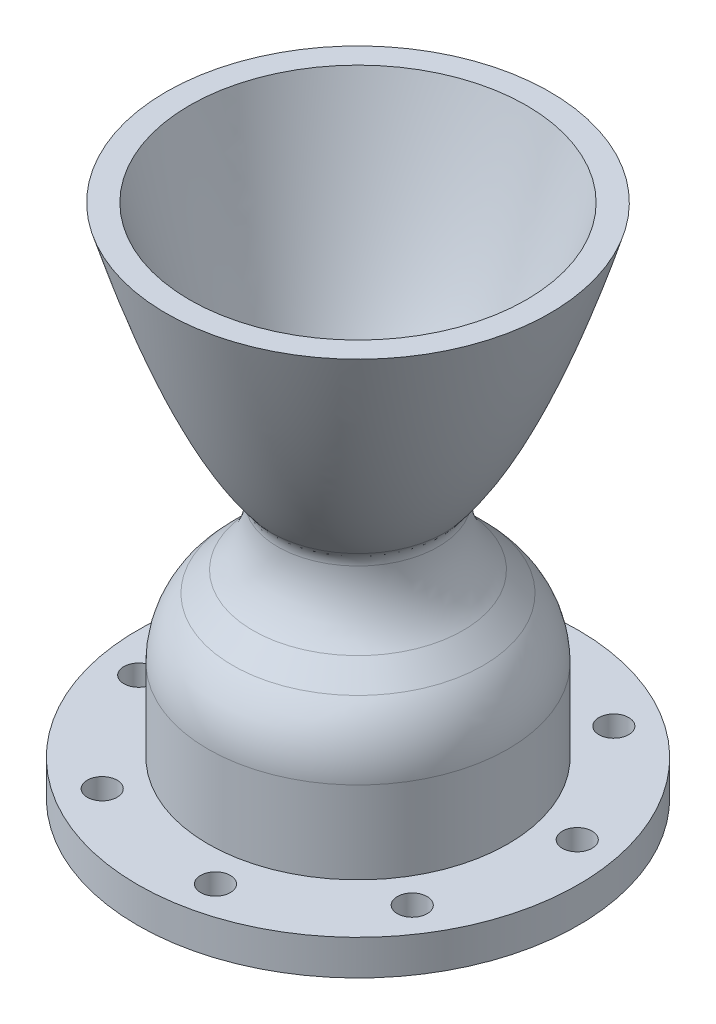
ISO-10303-21;
HEADER;
FILE_DESCRIPTION(('STEP AP214'),'2;1');
FILE_NAME('part.step','',(''),(''),'','','');
FILE_SCHEMA(('AUTOMOTIVE_DESIGN { 1 0 10303 214 1 1 1 1 }'));
ENDSEC;
DATA;
#1=APPLICATION_CONTEXT('core data for automotive mechanical design processes');
#2=APPLICATION_PROTOCOL_DEFINITION('international standard','automotive_design',2000,#1);
#3=PRODUCT_CONTEXT('',#1,'mechanical');
#4=PRODUCT('Part','Part','',(#3));
#5=PRODUCT_RELATED_PRODUCT_CATEGORY('part','',(#4));
#6=PRODUCT_DEFINITION_FORMATION('','',#4);
#7=PRODUCT_DEFINITION_CONTEXT('part definition',#1,'design');
#8=PRODUCT_DEFINITION('design','',#6,#7);
#9=PRODUCT_DEFINITION_SHAPE('','',#8);
#10=(LENGTH_UNIT() NAMED_UNIT(*) SI_UNIT(.MILLI.,.METRE.));
#11=(NAMED_UNIT(*) PLANE_ANGLE_UNIT() SI_UNIT($,.RADIAN.));
#12=(NAMED_UNIT(*) SI_UNIT($,.STERADIAN.) SOLID_ANGLE_UNIT());
#13=UNCERTAINTY_MEASURE_WITH_UNIT(LENGTH_MEASURE(1.E-05),#10,'distance_accuracy_value','');
#14=(GEOMETRIC_REPRESENTATION_CONTEXT(3) GLOBAL_UNCERTAINTY_ASSIGNED_CONTEXT((#13)) GLOBAL_UNIT_ASSIGNED_CONTEXT((#10,
#11,#12)) REPRESENTATION_CONTEXT('',''));
#15=CARTESIAN_POINT('',(0.,0.,0.));
#16=DIRECTION('',(0.,0.,1.));
#17=DIRECTION('',(1.,0.,0.));
#18=AXIS2_PLACEMENT_3D('',#15,#16,#17);
#19=CARTESIAN_POINT('',(-0.00553212594954357,165.815985113531,0.));
#20=DIRECTION('',(0.,1.,0.));
#21=DIRECTION('',(-1.,0.,0.));
#22=AXIS2_PLACEMENT_3D('',#19,#20,#21);
#23=CYLINDRICAL_SURFACE('',#22,53.8870597874087);
#24=CARTESIAN_POINT('',(-0.00553212594952976,-59.7275132223151,0.));
#25=DIRECTION('',(0.,1.,0.));
#26=DIRECTION('',(-1.,0.,0.));
#27=AXIS2_PLACEMENT_3D('',#24,#25,#26);
#28=CIRCLE('',#27,53.8870597874087);
#29=CARTESIAN_POINT('',(-53.8925919133582,-59.7275132223151,0.));
#30=VERTEX_POINT('',#29);
#31=EDGE_CURVE('E98',#30,#30,#28,.T.);
#32=ORIENTED_EDGE('',*,*,#31,.T.);
#33=EDGE_LOOP('',(#32));
#34=FACE_BOUND('',#33,.T.);
#35=CARTESIAN_POINT('',(-0.00553212594952706,-103.744683547694,0.));
#36=DIRECTION('',(0.,-1.,0.));
#37=DIRECTION('',(0.,0.,-1.));
#38=AXIS2_PLACEMENT_3D('',#35,#36,#37);
#39=CIRCLE('',#38,53.8870597874087);
#40=CARTESIAN_POINT('',(-0.00553212594952706,-103.744683547694,-53.8870597874087));
#41=VERTEX_POINT('',#40);
#42=EDGE_CURVE('E40',#41,#41,#39,.F.);
#43=ORIENTED_EDGE('',*,*,#42,.F.);
#44=EDGE_LOOP('',(#43));
#45=FACE_BOUND('',#44,.T.);
#46=ADVANCED_FACE('F36',(#34,#45),#23,.F.);
#47=CARTESIAN_POINT('',(0.,-109.744683547694,0.));
#48=DIRECTION('',(0.,1.,0.));
#49=DIRECTION('',(0.,0.,1.));
#50=AXIS2_PLACEMENT_3D('',#47,#48,#49);
#51=PLANE('',#50);
#52=CARTESIAN_POINT('',(0.,-109.744683547694,0.));
#53=DIRECTION('',(0.,-1.,0.));
#54=DIRECTION('',(0.,0.,-1.));
#55=AXIS2_PLACEMENT_3D('',#52,#53,#54);
#56=CIRCLE('',#55,56.8815276614592);
#57=CARTESIAN_POINT('',(0.,-109.744683547694,-56.8815276614592));
#58=VERTEX_POINT('',#57);
#59=EDGE_CURVE('E267',#58,#58,#56,.T.);
#60=ORIENTED_EDGE('',*,*,#59,.F.);
#61=EDGE_LOOP('',(#60));
#62=FACE_BOUND('',#61,.T.);
#63=CARTESIAN_POINT('',(0.,-109.744683547694,0.));
#64=DIRECTION('',(0.,1.,0.));
#65=DIRECTION('',(0.,0.,1.));
#66=AXIS2_PLACEMENT_3D('',#63,#64,#65);
#67=CIRCLE('',#66,93.8815276614418);
#68=CARTESIAN_POINT('',(0.,-109.744683547694,93.8815276614418));
#69=VERTEX_POINT('',#68);
#70=EDGE_CURVE('E10',#69,#69,#67,.T.);
#71=ORIENTED_EDGE('',*,*,#70,.F.);
#72=EDGE_LOOP('',(#71));
#73=FACE_BOUND('',#72,.T.);
#74=CARTESIAN_POINT('',(16.3377712930376,-109.744683547694,77.0486836093337));
#75=DIRECTION('',(0.,1.,0.));
#76=DIRECTION('',(0.,0.,1.));
#77=AXIS2_PLACEMENT_3D('',#74,#75,#76);
#78=CIRCLE('',#77,6.34999999999999);
#79=CARTESIAN_POINT('',(16.3377712930376,-109.744683547694,83.3986836093337));
#80=VERTEX_POINT('',#79);
#81=EDGE_CURVE('E50',#80,#80,#78,.F.);
#82=ORIENTED_EDGE('',*,*,#81,.F.);
#83=EDGE_LOOP('',(#82));
#84=FACE_BOUND('',#83,.T.);
#85=CARTESIAN_POINT('',(77.0486836093336,-109.744683547694,-16.3377712930379));
#86=DIRECTION('',(0.,1.,0.));
#87=DIRECTION('',(0.,0.,1.));
#88=AXIS2_PLACEMENT_3D('',#85,#86,#87);
#89=CIRCLE('',#88,6.34999999999998);
#90=CARTESIAN_POINT('',(77.0486836093336,-109.744683547694,-9.98777129303792));
#91=VERTEX_POINT('',#90);
#92=EDGE_CURVE('E60',#91,#91,#89,.F.);
#93=ORIENTED_EDGE('',*,*,#92,.F.);
#94=EDGE_LOOP('',(#93));
#95=FACE_BOUND('',#94,.T.);
#96=CARTESIAN_POINT('',(-16.3377712930382,-109.744683547694,-77.0486836093336));
#97=DIRECTION('',(0.,1.,0.));
#98=DIRECTION('',(0.,0.,1.));
#99=AXIS2_PLACEMENT_3D('',#96,#97,#98);
#100=CIRCLE('',#99,6.34999999999999);
#101=CARTESIAN_POINT('',(-16.3377712930382,-109.744683547694,-70.6986836093336));
#102=VERTEX_POINT('',#101);
#103=EDGE_CURVE('E68',#102,#102,#100,.F.);
#104=ORIENTED_EDGE('',*,*,#103,.F.);
#105=EDGE_LOOP('',(#104));
#106=FACE_BOUND('',#105,.T.);
#107=CARTESIAN_POINT('',(-77.0486836093335,-109.744683547694,16.3377712930384));
#108=DIRECTION('',(0.,1.,0.));
#109=DIRECTION('',(0.,0.,1.));
#110=AXIS2_PLACEMENT_3D('',#107,#108,#109);
#111=CIRCLE('',#110,6.34999999999998);
#112=CARTESIAN_POINT('',(-77.0486836093335,-109.744683547694,22.6877712930384));
#113=VERTEX_POINT('',#112);
#114=EDGE_CURVE('E76',#113,#113,#111,.F.);
#115=ORIENTED_EDGE('',*,*,#114,.F.);
#116=EDGE_LOOP('',(#115));
#117=FACE_BOUND('',#116,.T.);
#118=CARTESIAN_POINT('',(-66.0341955324388,-109.744683547694,-42.9290977908743));
#119=DIRECTION('',(0.,1.,0.));
#120=DIRECTION('',(0.,0.,1.));
#121=AXIS2_PLACEMENT_3D('',#118,#119,#120);
#122=CIRCLE('',#121,6.34999999999999);
#123=CARTESIAN_POINT('',(-66.0341955324388,-109.744683547694,-36.5790977908743));
#124=VERTEX_POINT('',#123);
#125=EDGE_CURVE('E72',#124,#124,#122,.F.);
#126=ORIENTED_EDGE('',*,*,#125,.F.);
#127=EDGE_LOOP('',(#126));
#128=FACE_BOUND('',#127,.T.);
#129=CARTESIAN_POINT('',(42.9290977908749,-109.744683547694,-66.0341955324384));
#130=DIRECTION('',(0.,1.,0.));
#131=DIRECTION('',(0.,0.,1.));
#132=AXIS2_PLACEMENT_3D('',#129,#130,#131);
#133=CIRCLE('',#132,6.34999999999999);
#134=CARTESIAN_POINT('',(42.9290977908749,-109.744683547694,-59.6841955324384));
#135=VERTEX_POINT('',#134);
#136=EDGE_CURVE('E64',#135,#135,#133,.F.);
#137=ORIENTED_EDGE('',*,*,#136,.F.);
#138=EDGE_LOOP('',(#137));
#139=FACE_BOUND('',#138,.T.);
#140=CARTESIAN_POINT('',(66.0341955324385,-109.744683547694,42.9290977908747));
#141=DIRECTION('',(0.,1.,0.));
#142=DIRECTION('',(0.,0.,1.));
#143=AXIS2_PLACEMENT_3D('',#140,#141,#142);
#144=CIRCLE('',#143,6.34999999999998);
#145=CARTESIAN_POINT('',(66.0341955324385,-109.744683547694,49.2790977908747));
#146=VERTEX_POINT('',#145);
#147=EDGE_CURVE('E56',#146,#146,#144,.F.);
#148=ORIENTED_EDGE('',*,*,#147,.F.);
#149=EDGE_LOOP('',(#148));
#150=FACE_BOUND('',#149,.T.);
#151=CARTESIAN_POINT('',(-42.9290977908749,-109.744683547694,66.0341955324384));
#152=DIRECTION('',(0.,1.,0.));
#153=DIRECTION('',(0.,0.,1.));
#154=AXIS2_PLACEMENT_3D('',#151,#152,#153);
#155=CIRCLE('',#154,6.34999999999999);
#156=CARTESIAN_POINT('',(-42.9290977908749,-109.744683547694,72.3841955324384));
#157=VERTEX_POINT('',#156);
#158=EDGE_CURVE('E45',#157,#157,#155,.F.);
#159=ORIENTED_EDGE('',*,*,#158,.F.);
#160=EDGE_LOOP('',(#159));
#161=FACE_BOUND('',#160,.T.);
#162=ADVANCED_FACE('F38',(#62,#73,#84,#95,#106,#117,#128,#139,#150,#161),#51,.F.);
#163=CARTESIAN_POINT('',(36.8348199161323,6.49222998464254,0.));
#164=CARTESIAN_POINT('',(59.2901874443699,34.627531396108,0.));
#165=CARTESIAN_POINT('',(81.7275236025348,109.927507640392,0.));
#166=B_SPLINE_CURVE_WITH_KNOTS('',2,(#163,#164,#165),.UNSPECIFIED.,.F.,.F.,(3,3),(0.,1.),.UNSPECIFIED.);
#167=CARTESIAN_POINT('',(-0.00553212594954357,165.815985113531,0.));
#168=DIRECTION('',(0.,1.,0.));
#169=AXIS1_PLACEMENT('',#167,#168);
#170=SURFACE_OF_REVOLUTION('',#166,#169);
#171=CARTESIAN_POINT('',(-0.00553212594954014,109.927507640393,0.));
#172=DIRECTION('',(0.,1.,0.));
#173=DIRECTION('',(-1.,0.,0.));
#174=AXIS2_PLACEMENT_3D('',#171,#172,#173);
#175=CIRCLE('',#174,81.7330557284828);
#176=CARTESIAN_POINT('',(-81.7385878544323,109.927507640393,0.));
#177=VERTEX_POINT('',#176);
#178=EDGE_CURVE('E122',#177,#177,#175,.T.);
#179=ORIENTED_EDGE('',*,*,#178,.F.);
#180=EDGE_LOOP('',(#179));
#181=FACE_BOUND('',#180,.T.);
#182=CARTESIAN_POINT('',(-0.00553212594953381,6.49222998464255,0.));
#183=DIRECTION('',(0.,1.,0.));
#184=DIRECTION('',(-1.,0.,0.));
#185=AXIS2_PLACEMENT_3D('',#182,#183,#184);
#186=CIRCLE('',#185,36.8403520420818);
#187=CARTESIAN_POINT('',(-36.8458841680313,6.49222998464255,0.));
#188=VERTEX_POINT('',#187);
#189=EDGE_CURVE('E118',#188,#188,#186,.T.);
#190=ORIENTED_EDGE('',*,*,#189,.T.);
#191=EDGE_LOOP('',(#190));
#192=FACE_BOUND('',#191,.T.);
#193=ADVANCED_FACE('F157',(#181,#192),#170,.T.);
#194=CARTESIAN_POINT('',(34.1386085874285,-0.0170096656933947,0.));
#195=CARTESIAN_POINT('',(34.1386092138728,0.0188829864821757,0.));
#196=CARTESIAN_POINT('',(34.1391470448244,0.0931040238253054,0.));
#197=CARTESIAN_POINT('',(34.1415644361508,0.25063140368994,0.));
#198=CARTESIAN_POINT('',(34.1480022812581,0.410054451399113,0.));
#199=CARTESIAN_POINT('',(34.1600743121532,0.629754600575022,0.));
#200=CARTESIAN_POINT('',(34.1809758004702,0.88442366214583,0.));
#201=CARTESIAN_POINT('',(34.214725432224,1.18552760717403,0.));
#202=CARTESIAN_POINT('',(34.2660400187457,1.52504083211395,0.));
#203=CARTESIAN_POINT('',(34.3300844148262,1.86398711124915,0.));
#204=CARTESIAN_POINT('',(34.406682314706,2.19934475428121,0.));
#205=CARTESIAN_POINT('',(34.4958642846635,2.53222975500066,0.));
#206=CARTESIAN_POINT('',(34.597282126498,2.86108297903266,0.));
#207=CARTESIAN_POINT('',(34.7111597839388,3.1863373753049,0.));
#208=CARTESIAN_POINT('',(34.836737484557,3.50661749150107,0.));
#209=CARTESIAN_POINT('',(34.974826690195,3.82265706702767,0.));
#210=CARTESIAN_POINT('',(35.1236110139373,4.13227251864,0.));
#211=CARTESIAN_POINT('',(35.285552935879,4.43777345706205,0.));
#212=CARTESIAN_POINT('',(35.4560292179553,4.73429190978832,0.));
#213=CARTESIAN_POINT('',(35.642055434384,5.02869419552913,0.));
#214=CARTESIAN_POINT('',(35.8313289833754,5.30850927023906,0.));
#215=CARTESIAN_POINT('',(36.0439461877771,5.59371787707124,0.));
#216=CARTESIAN_POINT('',(36.2184170875833,5.81590398160294,0.));
#217=CARTESIAN_POINT('',(36.4058864691957,6.03294197087187,0.));
#218=CARTESIAN_POINT('',(36.5440959612636,6.19163198042227,0.));
#219=CARTESIAN_POINT('',(36.7099827835806,6.36511211332681,0.));
#220=CARTESIAN_POINT('',(36.784060974214,6.44146917555451,0.));
#221=CARTESIAN_POINT('',(36.8348199161343,6.49222998464454,0.));
#222=B_SPLINE_CURVE_WITH_KNOTS('',4,(#194,#195,#196,#197,#198,#199,#200,#201,#202,#203,#204,
#205,#206,#207,#208,#209,#210,#211,#212,#213,#214,#215,#216,#217,#218,#219,#220,#221),
.UNSPECIFIED.,.F.,.F.,(5,1,1,1,1,1,1,1,1,1,1,1,1,1,1,1,1,1,1,1,1,1,1,1,5),(0.0825688161645696,
0.102426634352839,0.122284452541109,0.14214227072938,0.16200008891765,0.201715725294183,
0.241431361670735,0.281146998047275,0.320862634423797,0.360578270800353,0.400293907176888,
0.440009543553394,0.479725179929955,0.519440816306493,0.559156452683,0.598872089059578,
0.638587725436122,0.678303361812625,0.718018998189203,0.75773463456574,0.797450270942234,
0.837165907318803,0.857023725507066,0.876881543695329,0.916597180071815),.UNSPECIFIED.);
#223=CARTESIAN_POINT('',(-0.00553212594954357,165.815985113531,0.));
#224=DIRECTION('',(0.,1.,0.));
#225=AXIS1_PLACEMENT('',#223,#224);
#226=SURFACE_OF_REVOLUTION('',#222,#225);
#227=ORIENTED_EDGE('',*,*,#189,.F.);
#228=EDGE_LOOP('',(#227));
#229=FACE_BOUND('',#228,.T.);
#230=CARTESIAN_POINT('',(-0.00553212594953341,-0.0170096656934016,0.));
#231=DIRECTION('',(0.,1.,0.));
#232=DIRECTION('',(-1.,0.,0.));
#233=AXIS2_PLACEMENT_3D('',#230,#231,#232);
#234=CIRCLE('',#233,34.1441407133781);
#235=CARTESIAN_POINT('',(-34.1496728393276,-0.0170096656934037,0.));
#236=VERTEX_POINT('',#235);
#237=EDGE_CURVE('E114',#236,#236,#234,.T.);
#238=ORIENTED_EDGE('',*,*,#237,.T.);
#239=EDGE_LOOP('',(#238));
#240=FACE_BOUND('',#239,.T.);
#241=ADVANCED_FACE('F160',(#229,#240),#226,.T.);
#242=CARTESIAN_POINT('',(44.7258235411524,-25.5768317950047,0.));
#243=CARTESIAN_POINT('',(44.6759531633956,-25.5269596099439,0.));
#244=CARTESIAN_POINT('',(44.5764006953456,-25.4266587245276,0.));
#245=CARTESIAN_POINT('',(44.2850993772586,-25.1308779875125,0.));
#246=CARTESIAN_POINT('',(43.9753668585187,-24.8054940666709,0.));
#247=CARTESIAN_POINT('',(43.5479907628902,-24.346825922538,0.));
#248=CARTESIAN_POINT('',(43.1117965043717,-23.8570146922183,0.));
#249=CARTESIAN_POINT('',(42.6636691521947,-23.3374318133398,0.));
#250=CARTESIAN_POINT('',(42.1282768581647,-22.6904551548586,0.));
#251=CARTESIAN_POINT('',(41.4987079270069,-21.8914214338143,0.));
#252=CARTESIAN_POINT('',(40.7975627328722,-20.940869747371,0.));
#253=CARTESIAN_POINT('',(40.0349858342166,-19.8227530680833,0.));
#254=CARTESIAN_POINT('',(39.3160731270938,-18.6782974276713,0.));
#255=CARTESIAN_POINT('',(38.6396801277161,-17.5069484636707,0.));
#256=CARTESIAN_POINT('',(38.00802011548,-16.3116194627088,0.));
#257=CARTESIAN_POINT('',(37.421213849567,-15.0932067969428,0.));
#258=CARTESIAN_POINT('',(36.8805440492233,-13.8538971514291,0.));
#259=CARTESIAN_POINT('',(36.3864861170358,-12.5951090017168,0.));
#260=CARTESIAN_POINT('',(35.9399017074779,-11.3188292628671,0.));
#261=CARTESIAN_POINT('',(35.5413113461335,-10.0266468742744,0.));
#262=CARTESIAN_POINT('',(35.191336034827,-8.72058417969044,0.));
#263=CARTESIAN_POINT('',(34.8904259531819,-7.4021760795674,0.));
#264=CARTESIAN_POINT('',(34.639026762842,-6.07372042475105,0.));
#265=CARTESIAN_POINT('',(34.4626673958876,-4.90346005231736,0.));
#266=CARTESIAN_POINT('',(34.3428404240372,-3.89698833886601,0.));
#267=CARTESIAN_POINT('',(34.2718277633469,-3.13904361064676,0.));
#268=CARTESIAN_POINT('',(34.2323595563843,-2.63507906369353,0.));
#269=CARTESIAN_POINT('',(34.2047219420423,-2.21071653552501,0.));
#270=CARTESIAN_POINT('',(34.1857666833804,-1.87894926696856,0.));
#271=CARTESIAN_POINT('',(34.1699664593091,-1.53044472203816,0.));
#272=CARTESIAN_POINT('',(34.1573241663396,-1.21183173542845,0.));
#273=CARTESIAN_POINT('',(34.1478390450772,-0.841170060510904,0.));
#274=CARTESIAN_POINT('',(34.1415146507557,-0.560192579775888,0.));
#275=CARTESIAN_POINT('',(34.1391389654072,-0.230593853579133,0.));
#276=CARTESIAN_POINT('',(34.1386098181722,-0.0875383109502816,0.));
#277=CARTESIAN_POINT('',(34.1386085874286,-0.0170096684081623,0.));
#278=B_SPLINE_CURVE_WITH_KNOTS('',4,(#242,#243,#244,#245,#246,#247,#248,#249,#250,#251,#252,
#253,#254,#255,#256,#257,#258,#259,#260,#261,#262,#263,#264,#265,#266,#267,#268,#269,#270,#271,
#272,#273,#274,#275,#276,#277),.UNSPECIFIED.,.F.,.F.,(5,1,1,1,1,1,1,1,1,1,1,1,1,1,1,1,1,1,1,1,1,
1,1,1,1,1,1,1,1,1,1,1,5),(0.0826377294216884,0.0925749262389921,0.102512123155224,
0.122386516987688,0.14226091082015,0.162135304652612,0.182009698485073,0.201884092317534,
0.241632879982458,0.281381667647382,0.321130455312305,0.360879242977226,0.400628030642147,
0.440376818307068,0.480125605971989,0.51987439363691,0.559623181301831,0.599371968966752,
0.639120756631673,0.678869544296593,0.718618331961514,0.758367119626435,0.798115907291356,
0.817990301123817,0.837864694956278,0.847801891872509,0.857739088788739,0.86767628570497,
0.8776134826212,0.88755067953743,0.897487876453661,0.907425073369891,0.917362270382752),.UNSPECIFIED.);
#279=CARTESIAN_POINT('',(-0.00553212594954357,165.815985113531,0.));
#280=DIRECTION('',(0.,1.,0.));
#281=AXIS1_PLACEMENT('',#279,#280);
#282=SURFACE_OF_REVOLUTION('',#278,#281);
#283=ORIENTED_EDGE('',*,*,#237,.F.);
#284=EDGE_LOOP('',(#283));
#285=FACE_BOUND('',#284,.T.);
#286=CARTESIAN_POINT('',(-0.00553212594953185,-25.5768317950047,0.));
#287=DIRECTION('',(0.,1.,0.));
#288=DIRECTION('',(-1.,0.,0.));
#289=AXIS2_PLACEMENT_3D('',#286,#287,#288);
#290=CIRCLE('',#289,44.731355667102);
#291=CARTESIAN_POINT('',(-44.7368877930515,-25.5768317950047,0.));
#292=VERTEX_POINT('',#291);
#293=EDGE_CURVE('E110',#292,#292,#290,.T.);
#294=ORIENTED_EDGE('',*,*,#293,.T.);
#295=EDGE_LOOP('',(#294));
#296=FACE_BOUND('',#295,.T.);
#297=ADVANCED_FACE('F165',(#285,#296),#282,.T.);
#298=CARTESIAN_POINT('',(-0.00553212594953132,-34.184459992969,0.));
#299=DIRECTION('',(0.,-1.,0.));
#300=DIRECTION('',(1.,0.,0.));
#301=AXIS2_PLACEMENT_3D('',#298,#299,#300);
#302=CONICAL_SURFACE('',#301,53.338983865285,0.785398163410157);
#303=ORIENTED_EDGE('',*,*,#293,.F.);
#304=EDGE_LOOP('',(#303));
#305=FACE_BOUND('',#304,.T.);
#306=CARTESIAN_POINT('',(-0.00553212594953132,-34.184459992969,0.));
#307=DIRECTION('',(0.,1.,0.));
#308=DIRECTION('',(-1.,0.,0.));
#309=AXIS2_PLACEMENT_3D('',#306,#307,#308);
#310=CIRCLE('',#309,53.338983865285);
#311=CARTESIAN_POINT('',(-53.3445159912345,-34.184459992969,0.));
#312=VERTEX_POINT('',#311);
#313=EDGE_CURVE('E106',#312,#312,#310,.T.);
#314=ORIENTED_EDGE('',*,*,#313,.T.);
#315=EDGE_LOOP('',(#314));
#316=FACE_BOUND('',#315,.T.);
#317=ADVANCED_FACE('F198',(#305,#316),#302,.T.);
#318=CARTESIAN_POINT('',(63.8815276614741,-59.7610263901982,0.));
#319=CARTESIAN_POINT('',(63.8816355026311,-59.690496419455,0.));
#320=CARTESIAN_POINT('',(63.8813253047457,-59.548918716792,0.));
#321=CARTESIAN_POINT('',(63.8794657326396,-59.2150739553457,0.));
#322=CARTESIAN_POINT('',(63.8735691560645,-58.938295381732,0.));
#323=CARTESIAN_POINT('',(63.8646593192035,-58.5660531528386,0.));
#324=CARTESIAN_POINT('',(63.8525108889179,-58.2463041173915,0.));
#325=CARTESIAN_POINT('',(63.8334269887286,-57.8150309099507,0.));
#326=CARTESIAN_POINT('',(63.8041888991913,-57.3143505519465,0.));
#327=CARTESIAN_POINT('',(63.7608937854615,-56.7213211543192,0.));
#328=CARTESIAN_POINT('',(63.6832874979112,-55.8816823352566,0.));
#329=CARTESIAN_POINT('',(63.5847255468552,-55.0412144018694,0.));
#330=CARTESIAN_POINT('',(63.4652670469412,-54.2052982333501,0.));
#331=CARTESIAN_POINT('',(63.2969487701593,-53.2050265478941,0.));
#332=CARTESIAN_POINT('',(63.1037410766707,-52.2097441496842,0.));
#333=CARTESIAN_POINT('',(62.8795815883548,-51.2204925732428,0.));
#334=CARTESIAN_POINT('',(62.624738161908,-50.2390472471317,0.));
#335=CARTESIAN_POINT('',(62.3455205099134,-49.2642029821403,0.));
#336=CARTESIAN_POINT('',(62.0420758763036,-48.2966240410013,0.));
#337=CARTESIAN_POINT('',(61.6529925841726,-47.1791868431962,0.));
#338=CARTESIAN_POINT('',(61.1609222859813,-45.9196977042101,0.));
#339=CARTESIAN_POINT('',(60.6220530785514,-44.6794232750575,0.));
#340=CARTESIAN_POINT('',(60.0372649671842,-43.4602501831239,0.));
#341=CARTESIAN_POINT('',(59.4071739961785,-42.2636660495198,0.));
#342=CARTESIAN_POINT('',(58.7329906220396,-41.0916836847359,0.));
#343=CARTESIAN_POINT('',(58.0151127616023,-39.9453899167452,0.));
#344=CARTESIAN_POINT('',(57.2554675355109,-38.8273173943405,0.));
#345=CARTESIAN_POINT('',(56.5537085024597,-37.8736065516634,0.));
#346=CARTESIAN_POINT('',(55.9286087764964,-37.076859239342,0.));
#347=CARTESIAN_POINT('',(55.3888979135622,-36.4237329720996,0.));
#348=CARTESIAN_POINT('',(54.9519950637272,-35.9139230565228,0.));
#349=CARTESIAN_POINT('',(54.5523364497582,-35.4660494860872,0.));
#350=CARTESIAN_POINT('',(54.2195785420718,-35.1031729805207,0.));
#351=CARTESIAN_POINT('',(53.912547537025,-34.778406744408,0.));
#352=CARTESIAN_POINT('',(53.7130184465088,-34.5693072286018,0.));
#353=CARTESIAN_POINT('',(53.4836987657815,-34.3359191506908,0.));
#354=CARTESIAN_POINT('',(53.3832467057854,-34.2344094508832,0.));
#355=CARTESIAN_POINT('',(53.333451732496,-34.1844599860426,0.));
#356=B_SPLINE_CURVE_WITH_KNOTS('',4,(#318,#319,#320,#321,#322,#323,#324,#325,#326,#327,#328,
#329,#330,#331,#332,#333,#334,#335,#336,#337,#338,#339,#340,#341,#342,#343,#344,#345,#346,#347,
#348,#349,#350,#351,#352,#353,#354,#355),.UNSPECIFIED.,.F.,.F.,(5,1,1,1,1,1,1,1,1,1,1,1,1,1,1,1,
1,1,1,1,1,1,1,1,1,1,1,1,1,1,1,1,1,1,5),(0.0826377291709618,0.0925749264345476,0.102512123350778,
0.112449320267009,0.122386517183239,0.132323714099469,0.1422609110157,0.162135304848161,
0.182009698680622,0.201884092513083,0.241632880178004,0.261507274010465,0.281381667842925,
0.321130455507847,0.360879243172768,0.380753637005229,0.40062803083769,0.440376818502612,
0.480125606167533,0.519874393832454,0.559623181497376,0.599371969162297,0.639120756827219,
0.67886954449214,0.718618332157062,0.758367119821984,0.798115907486905,0.817990301319366,
0.837864695151827,0.857739088984288,0.877613482816748,0.887550679732981,0.897487876649213,
0.907425073565445,0.917362270138831),.UNSPECIFIED.);
#357=CARTESIAN_POINT('',(-0.00553212594954357,165.815985113531,0.));
#358=DIRECTION('',(0.,1.,0.));
#359=AXIS1_PLACEMENT('',#357,#358);
#360=SURFACE_OF_REVOLUTION('',#356,#359);
#361=ORIENTED_EDGE('',*,*,#313,.F.);
#362=EDGE_LOOP('',(#361));
#363=FACE_BOUND('',#362,.T.);
#364=CARTESIAN_POINT('',(-0.00553212594952975,-59.7610263901982,0.));
#365=DIRECTION('',(0.,1.,0.));
#366=DIRECTION('',(-1.,0.,0.));
#367=AXIS2_PLACEMENT_3D('',#364,#365,#366);
#368=CIRCLE('',#367,63.8870597874237);
#369=CARTESIAN_POINT('',(-63.8925919133732,-59.7610263901982,0.));
#370=VERTEX_POINT('',#369);
#371=EDGE_CURVE('E102',#370,#370,#368,.T.);
#372=ORIENTED_EDGE('',*,*,#371,.T.);
#373=EDGE_LOOP('',(#372));
#374=FACE_BOUND('',#373,.T.);
#375=ADVANCED_FACE('F194',(#363,#374),#360,.T.);
#376=CARTESIAN_POINT('',(-0.00553212594954357,165.815985113531,0.));
#377=DIRECTION('',(0.,1.,0.));
#378=DIRECTION('',(-1.,0.,0.));
#379=AXIS2_PLACEMENT_3D('',#376,#377,#378);
#380=CYLINDRICAL_SURFACE('',#379,63.8870597874158);
#381=CARTESIAN_POINT('',(-0.00553212594952761,-94.744683547694,0.));
#382=DIRECTION('',(0.,1.,0.));
#383=DIRECTION('',(0.,0.,1.));
#384=AXIS2_PLACEMENT_3D('',#381,#382,#383);
#385=CIRCLE('',#384,63.8870597874158);
#386=CARTESIAN_POINT('',(-0.00553212594952761,-94.744683547694,63.8870597874158));
#387=VERTEX_POINT('',#386);
#388=EDGE_CURVE('E81',#387,#387,#385,.T.);
#389=ORIENTED_EDGE('',*,*,#388,.T.);
#390=EDGE_LOOP('',(#389));
#391=FACE_BOUND('',#390,.T.);
#392=ORIENTED_EDGE('',*,*,#371,.F.);
#393=EDGE_LOOP('',(#392));
#394=FACE_BOUND('',#393,.T.);
#395=ADVANCED_FACE('F197',(#391,#394),#380,.T.);
#396=CARTESIAN_POINT('',(0.,-94.744683547694,0.));
#397=DIRECTION('',(0.,1.,0.));
#398=DIRECTION('',(0.,0.,1.));
#399=AXIS2_PLACEMENT_3D('',#396,#397,#398);
#400=PLANE('',#399);
#401=CARTESIAN_POINT('',(-77.0486836093335,-94.744683547694,16.3377712930384));
#402=DIRECTION('',(0.,1.,0.));
#403=DIRECTION('',(0.,0.,1.));
#404=AXIS2_PLACEMENT_3D('',#401,#402,#403);
#405=CIRCLE('',#404,6.34999999999998);
#406=CARTESIAN_POINT('',(-77.0486836093335,-94.744683547694,22.6877712930384));
#407=VERTEX_POINT('',#406);
#408=EDGE_CURVE('E263',#407,#407,#405,.T.);
#409=ORIENTED_EDGE('',*,*,#408,.F.);
#410=EDGE_LOOP('',(#409));
#411=FACE_BOUND('',#410,.T.);
#412=CARTESIAN_POINT('',(-66.0341955324388,-94.744683547694,-42.9290977908743));
#413=DIRECTION('',(0.,1.,0.));
#414=DIRECTION('',(0.,0.,1.));
#415=AXIS2_PLACEMENT_3D('',#412,#413,#414);
#416=CIRCLE('',#415,6.34999999999999);
#417=CARTESIAN_POINT('',(-66.0341955324388,-94.744683547694,-36.5790977908743));
#418=VERTEX_POINT('',#417);
#419=EDGE_CURVE('E259',#418,#418,#416,.T.);
#420=ORIENTED_EDGE('',*,*,#419,.F.);
#421=EDGE_LOOP('',(#420));
#422=FACE_BOUND('',#421,.T.);
#423=CARTESIAN_POINT('',(-16.3377712930382,-94.744683547694,-77.0486836093336));
#424=DIRECTION('',(0.,1.,0.));
#425=DIRECTION('',(0.,0.,1.));
#426=AXIS2_PLACEMENT_3D('',#423,#424,#425);
#427=CIRCLE('',#426,6.34999999999999);
#428=CARTESIAN_POINT('',(-16.3377712930382,-94.744683547694,-70.6986836093336));
#429=VERTEX_POINT('',#428);
#430=EDGE_CURVE('E255',#429,#429,#427,.T.);
#431=ORIENTED_EDGE('',*,*,#430,.F.);
#432=EDGE_LOOP('',(#431));
#433=FACE_BOUND('',#432,.T.);
#434=CARTESIAN_POINT('',(42.9290977908749,-94.744683547694,-66.0341955324384));
#435=DIRECTION('',(0.,1.,0.));
#436=DIRECTION('',(0.,0.,1.));
#437=AXIS2_PLACEMENT_3D('',#434,#435,#436);
#438=CIRCLE('',#437,6.34999999999999);
#439=CARTESIAN_POINT('',(42.9290977908749,-94.744683547694,-59.6841955324384));
#440=VERTEX_POINT('',#439);
#441=EDGE_CURVE('E251',#440,#440,#438,.T.);
#442=ORIENTED_EDGE('',*,*,#441,.F.);
#443=EDGE_LOOP('',(#442));
#444=FACE_BOUND('',#443,.T.);
#445=CARTESIAN_POINT('',(77.0486836093336,-94.744683547694,-16.3377712930379));
#446=DIRECTION('',(0.,1.,0.));
#447=DIRECTION('',(0.,0.,1.));
#448=AXIS2_PLACEMENT_3D('',#445,#446,#447);
#449=CIRCLE('',#448,6.34999999999998);
#450=CARTESIAN_POINT('',(77.0486836093336,-94.744683547694,-9.98777129303792));
#451=VERTEX_POINT('',#450);
#452=EDGE_CURVE('E247',#451,#451,#449,.T.);
#453=ORIENTED_EDGE('',*,*,#452,.F.);
#454=EDGE_LOOP('',(#453));
#455=FACE_BOUND('',#454,.T.);
#456=CARTESIAN_POINT('',(66.0341955324385,-94.744683547694,42.9290977908747));
#457=DIRECTION('',(0.,1.,0.));
#458=DIRECTION('',(0.,0.,1.));
#459=AXIS2_PLACEMENT_3D('',#456,#457,#458);
#460=CIRCLE('',#459,6.34999999999998);
#461=CARTESIAN_POINT('',(66.0341955324385,-94.744683547694,49.2790977908747));
#462=VERTEX_POINT('',#461);
#463=EDGE_CURVE('E243',#462,#462,#460,.T.);
#464=ORIENTED_EDGE('',*,*,#463,.F.);
#465=EDGE_LOOP('',(#464));
#466=FACE_BOUND('',#465,.T.);
#467=CARTESIAN_POINT('',(16.3377712930376,-94.744683547694,77.0486836093337));
#468=DIRECTION('',(0.,1.,0.));
#469=DIRECTION('',(0.,0.,1.));
#470=AXIS2_PLACEMENT_3D('',#467,#468,#469);
#471=CIRCLE('',#470,6.34999999999999);
#472=CARTESIAN_POINT('',(16.3377712930376,-94.744683547694,83.3986836093337));
#473=VERTEX_POINT('',#472);
#474=EDGE_CURVE('E239',#473,#473,#471,.T.);
#475=ORIENTED_EDGE('',*,*,#474,.F.);
#476=EDGE_LOOP('',(#475));
#477=FACE_BOUND('',#476,.T.);
#478=CARTESIAN_POINT('',(-42.9290977908749,-94.744683547694,66.0341955324384));
#479=DIRECTION('',(0.,1.,0.));
#480=DIRECTION('',(0.,0.,1.));
#481=AXIS2_PLACEMENT_3D('',#478,#479,#480);
#482=CIRCLE('',#481,6.34999999999999);
#483=CARTESIAN_POINT('',(-42.9290977908749,-94.744683547694,72.3841955324384));
#484=VERTEX_POINT('',#483);
#485=EDGE_CURVE('E235',#484,#484,#482,.T.);
#486=ORIENTED_EDGE('',*,*,#485,.F.);
#487=EDGE_LOOP('',(#486));
#488=FACE_BOUND('',#487,.T.);
#489=ORIENTED_EDGE('',*,*,#388,.F.);
#490=EDGE_LOOP('',(#489));
#491=FACE_BOUND('',#490,.T.);
#492=CARTESIAN_POINT('',(0.,-94.744683547694,0.));
#493=DIRECTION('',(0.,1.,0.));
#494=DIRECTION('',(0.,0.,1.));
#495=AXIS2_PLACEMENT_3D('',#492,#493,#494);
#496=CIRCLE('',#495,93.8815276614418);
#497=CARTESIAN_POINT('',(0.,-94.744683547694,93.8815276614418));
#498=VERTEX_POINT('',#497);
#499=EDGE_CURVE('E86',#498,#498,#496,.T.);
#500=ORIENTED_EDGE('',*,*,#499,.T.);
#501=EDGE_LOOP('',(#500));
#502=FACE_BOUND('',#501,.T.);
#503=ADVANCED_FACE('F202',(#411,#422,#433,#444,#455,#466,#477,#488,#491,#502),#400,.T.);
#504=CARTESIAN_POINT('',(-77.0486836093335,-262.944683547694,16.3377712930384));
#505=DIRECTION('',(0.,-1.,0.));
#506=DIRECTION('',(0.,0.,-1.));
#507=AXIS2_PLACEMENT_3D('',#504,#505,#506);
#508=CYLINDRICAL_SURFACE('',#507,6.34999999999998);
#509=ORIENTED_EDGE('',*,*,#114,.T.);
#510=EDGE_LOOP('',(#509));
#511=FACE_BOUND('',#510,.T.);
#512=ORIENTED_EDGE('',*,*,#408,.T.);
#513=EDGE_LOOP('',(#512));
#514=FACE_BOUND('',#513,.T.);
#515=ADVANCED_FACE('F291',(#511,#514),#508,.F.);
#516=CARTESIAN_POINT('',(-66.0341955324388,-262.944683547694,-42.9290977908743));
#517=DIRECTION('',(0.,-1.,0.));
#518=DIRECTION('',(0.,0.,-1.));
#519=AXIS2_PLACEMENT_3D('',#516,#517,#518);
#520=CYLINDRICAL_SURFACE('',#519,6.34999999999999);
#521=ORIENTED_EDGE('',*,*,#125,.T.);
#522=EDGE_LOOP('',(#521));
#523=FACE_BOUND('',#522,.T.);
#524=ORIENTED_EDGE('',*,*,#419,.T.);
#525=EDGE_LOOP('',(#524));
#526=FACE_BOUND('',#525,.T.);
#527=ADVANCED_FACE('F294',(#523,#526),#520,.F.);
#528=CARTESIAN_POINT('',(-16.3377712930382,-262.944683547694,-77.0486836093336));
#529=DIRECTION('',(0.,-1.,0.));
#530=DIRECTION('',(0.,0.,-1.));
#531=AXIS2_PLACEMENT_3D('',#528,#529,#530);
#532=CYLINDRICAL_SURFACE('',#531,6.34999999999999);
#533=ORIENTED_EDGE('',*,*,#103,.T.);
#534=EDGE_LOOP('',(#533));
#535=FACE_BOUND('',#534,.T.);
#536=ORIENTED_EDGE('',*,*,#430,.T.);
#537=EDGE_LOOP('',(#536));
#538=FACE_BOUND('',#537,.T.);
#539=ADVANCED_FACE('F298',(#535,#538),#532,.F.);
#540=CARTESIAN_POINT('',(42.9290977908749,-262.944683547694,-66.0341955324384));
#541=DIRECTION('',(0.,-1.,0.));
#542=DIRECTION('',(0.,0.,-1.));
#543=AXIS2_PLACEMENT_3D('',#540,#541,#542);
#544=CYLINDRICAL_SURFACE('',#543,6.34999999999999);
#545=ORIENTED_EDGE('',*,*,#136,.T.);
#546=EDGE_LOOP('',(#545));
#547=FACE_BOUND('',#546,.T.);
#548=ORIENTED_EDGE('',*,*,#441,.T.);
#549=EDGE_LOOP('',(#548));
#550=FACE_BOUND('',#549,.T.);
#551=ADVANCED_FACE('F302',(#547,#550),#544,.F.);
#552=CARTESIAN_POINT('',(77.0486836093336,-262.944683547694,-16.3377712930379));
#553=DIRECTION('',(0.,-1.,0.));
#554=DIRECTION('',(0.,0.,-1.));
#555=AXIS2_PLACEMENT_3D('',#552,#553,#554);
#556=CYLINDRICAL_SURFACE('',#555,6.34999999999998);
#557=ORIENTED_EDGE('',*,*,#92,.T.);
#558=EDGE_LOOP('',(#557));
#559=FACE_BOUND('',#558,.T.);
#560=ORIENTED_EDGE('',*,*,#452,.T.);
#561=EDGE_LOOP('',(#560));
#562=FACE_BOUND('',#561,.T.);
#563=ADVANCED_FACE('F306',(#559,#562),#556,.F.);
#564=CARTESIAN_POINT('',(66.0341955324385,-262.944683547694,42.9290977908747));
#565=DIRECTION('',(0.,-1.,0.));
#566=DIRECTION('',(0.,0.,-1.));
#567=AXIS2_PLACEMENT_3D('',#564,#565,#566);
#568=CYLINDRICAL_SURFACE('',#567,6.34999999999998);
#569=ORIENTED_EDGE('',*,*,#147,.T.);
#570=EDGE_LOOP('',(#569));
#571=FACE_BOUND('',#570,.T.);
#572=ORIENTED_EDGE('',*,*,#463,.T.);
#573=EDGE_LOOP('',(#572));
#574=FACE_BOUND('',#573,.T.);
#575=ADVANCED_FACE('F310',(#571,#574),#568,.F.);
#576=CARTESIAN_POINT('',(16.3377712930376,-262.944683547694,77.0486836093337));
#577=DIRECTION('',(0.,-1.,0.));
#578=DIRECTION('',(0.,0.,-1.));
#579=AXIS2_PLACEMENT_3D('',#576,#577,#578);
#580=CYLINDRICAL_SURFACE('',#579,6.34999999999999);
#581=ORIENTED_EDGE('',*,*,#81,.T.);
#582=EDGE_LOOP('',(#581));
#583=FACE_BOUND('',#582,.T.);
#584=ORIENTED_EDGE('',*,*,#474,.T.);
#585=EDGE_LOOP('',(#584));
#586=FACE_BOUND('',#585,.T.);
#587=ADVANCED_FACE('F314',(#583,#586),#580,.F.);
#588=CARTESIAN_POINT('',(-42.9290977908749,-262.944683547694,66.0341955324384));
#589=DIRECTION('',(0.,-1.,0.));
#590=DIRECTION('',(0.,0.,-1.));
#591=AXIS2_PLACEMENT_3D('',#588,#589,#590);
#592=CYLINDRICAL_SURFACE('',#591,6.34999999999999);
#593=ORIENTED_EDGE('',*,*,#158,.T.);
#594=EDGE_LOOP('',(#593));
#595=FACE_BOUND('',#594,.T.);
#596=ORIENTED_EDGE('',*,*,#485,.T.);
#597=EDGE_LOOP('',(#596));
#598=FACE_BOUND('',#597,.T.);
#599=ADVANCED_FACE('F318',(#595,#598),#592,.F.);
#600=CARTESIAN_POINT('',(0.,-94.744683547694,0.));
#601=DIRECTION('',(0.,-1.,0.));
#602=DIRECTION('',(0.,0.,-1.));
#603=AXIS2_PLACEMENT_3D('',#600,#601,#602);
#604=CYLINDRICAL_SURFACE('',#603,93.8815276614418);
#605=ORIENTED_EDGE('',*,*,#70,.T.);
#606=EDGE_LOOP('',(#605));
#607=FACE_BOUND('',#606,.T.);
#608=ORIENTED_EDGE('',*,*,#499,.F.);
#609=EDGE_LOOP('',(#608));
#610=FACE_BOUND('',#609,.T.);
#611=ADVANCED_FACE('F152',(#607,#610),#604,.T.);
#612=CARTESIAN_POINT('',(71.7275236025332,109.927507640396,0.));
#613=DIRECTION('',(0.,-1.,0.));
#614=DIRECTION('',(1.,0.,0.));
#615=AXIS2_PLACEMENT_3D('',#612,#613,#614);
#616=PLANE('',#615);
#617=CARTESIAN_POINT('',(-0.00553212594954014,109.9275076404,0.));
#618=DIRECTION('',(0.,1.,0.));
#619=DIRECTION('',(-1.,0.,0.));
#620=AXIS2_PLACEMENT_3D('',#617,#618,#619);
#621=CIRCLE('',#620,71.7330557284856);
#622=CARTESIAN_POINT('',(-71.7385878544351,109.9275076404,0.));
#623=VERTEX_POINT('',#622);
#624=EDGE_CURVE('E126',#623,#623,#621,.T.);
#625=ORIENTED_EDGE('',*,*,#624,.F.);
#626=EDGE_LOOP('',(#625));
#627=FACE_BOUND('',#626,.T.);
#628=ORIENTED_EDGE('',*,*,#178,.T.);
#629=EDGE_LOOP('',(#628));
#630=FACE_BOUND('',#629,.T.);
#631=ADVANCED_FACE('F150',(#627,#630),#616,.F.);
#632=CARTESIAN_POINT('',(71.727523602536,109.9275076404,0.));
#633=CARTESIAN_POINT('',(49.2614014026931,34.6361148417137,0.));
#634=CARTESIAN_POINT('',(26.7952792027517,6.5094003226031,0.));
#635=B_SPLINE_CURVE_WITH_KNOTS('',2,(#632,#633,#634),.UNSPECIFIED.,.F.,.F.,(3,3),(0.,1.),.UNSPECIFIED.);
#636=CARTESIAN_POINT('',(-0.00553212594954357,165.815985113531,0.));
#637=DIRECTION('',(0.,1.,0.));
#638=AXIS1_PLACEMENT('',#636,#637);
#639=SURFACE_OF_REVOLUTION('',#635,#638);
#640=CARTESIAN_POINT('',(-0.00553212594953381,6.50940032260311,0.));
#641=DIRECTION('',(0.,1.,0.));
#642=DIRECTION('',(-1.,0.,0.));
#643=AXIS2_PLACEMENT_3D('',#640,#641,#642);
#644=CIRCLE('',#643,26.8008113287012);
#645=CARTESIAN_POINT('',(-26.8063434546508,6.50940032260311,0.));
#646=VERTEX_POINT('',#645);
#647=EDGE_CURVE('E85',#646,#646,#644,.T.);
#648=ORIENTED_EDGE('',*,*,#647,.F.);
#649=EDGE_LOOP('',(#648));
#650=FACE_BOUND('',#649,.T.);
#651=ORIENTED_EDGE('',*,*,#624,.T.);
#652=EDGE_LOOP('',(#651));
#653=FACE_BOUND('',#652,.T.);
#654=ADVANCED_FACE('F145',(#650,#653),#639,.T.);
#655=CARTESIAN_POINT('',(26.7952792027528,6.50940032260603,0.));
#656=CARTESIAN_POINT('',(26.7445202608308,6.45863951351429,0.));
#657=CARTESIAN_POINT('',(26.6704420701981,6.38228245128715,0.));
#658=CARTESIAN_POINT('',(26.5045552478774,6.20880231837844,0.));
#659=CARTESIAN_POINT('',(26.3663457558084,6.0501123088261,0.));
#660=CARTESIAN_POINT('',(26.1788763741962,5.83307431955689,0.));
#661=CARTESIAN_POINT('',(26.0044054743904,5.61088821502492,0.));
#662=CARTESIAN_POINT('',(25.7917882699891,5.32567960819241,0.));
#663=CARTESIAN_POINT('',(25.6025147209982,5.0458645334822,0.));
#664=CARTESIAN_POINT('',(25.41648850457,4.75146224774109,0.));
#665=CARTESIAN_POINT('',(25.2460122224941,4.45494379501456,0.));
#666=CARTESIAN_POINT('',(25.0840703005529,4.14944285659226,0.));
#667=CARTESIAN_POINT('',(24.935285976811,3.8398274049797,0.));
#668=CARTESIAN_POINT('',(24.7971967711735,3.52378782945289,0.));
#669=CARTESIAN_POINT('',(24.6716190705559,3.20350771325653,0.));
#670=CARTESIAN_POINT('',(24.5577414131155,2.87825331698411,0.));
#671=CARTESIAN_POINT('',(24.4563235712815,2.54940009295196,0.));
#672=CARTESIAN_POINT('',(24.3671416013245,2.21651509223236,0.));
#673=CARTESIAN_POINT('',(24.2905437014453,1.88115744920019,0.));
#674=CARTESIAN_POINT('',(24.2264993053653,1.54221117006489,0.));
#675=CARTESIAN_POINT('',(24.1751847188441,1.20269794512489,0.));
#676=CARTESIAN_POINT('',(24.1414350870908,0.90159400009664,0.));
#677=CARTESIAN_POINT('',(24.1205335987741,0.646924938525799,0.));
#678=CARTESIAN_POINT('',(24.1084615678794,0.427224789349872,0.));
#679=CARTESIAN_POINT('',(24.1020237227721,0.267801741635842,0.));
#680=CARTESIAN_POINT('',(24.099606331446,0.110274361763279,0.));
#681=CARTESIAN_POINT('',(24.0990685004946,0.0360533244193808,0.));
#682=CARTESIAN_POINT('',(24.0990678740505,0.000160672239889663,0.));
#683=B_SPLINE_CURVE_WITH_KNOTS('',4,(#655,#656,#657,#658,#659,#660,#661,#662,#663,#664,#665,
#666,#667,#668,#669,#670,#671,#672,#673,#674,#675,#676,#677,#678,#679,#680,#681,#682),
.UNSPECIFIED.,.F.,.F.,(5,1,1,1,1,1,1,1,1,1,1,1,1,1,1,1,1,1,1,1,1,1,1,1,5),(0.0825688161645696,
0.122284452541055,0.142142270729318,0.162000088917581,0.201715725294151,0.241431361670644,
0.281146998047181,0.320862634423759,0.360578270800262,0.400293907176806,0.440009543553384,
0.479725179929891,0.519440816306429,0.55915645268299,0.598872089059496,0.638587725436031,
0.678303361812587,0.718018998189109,0.75773463456565,0.797450270942201,0.837165907318734,
0.857023725507005,0.876881543695275,0.896739361883545,0.916597180071815),.UNSPECIFIED.);
#684=CARTESIAN_POINT('',(-0.00553212594954357,165.815985113531,0.));
#685=DIRECTION('',(0.,1.,0.));
#686=AXIS1_PLACEMENT('',#684,#685);
#687=SURFACE_OF_REVOLUTION('',#683,#686);
#688=CARTESIAN_POINT('',(-0.00553212594953341,0.000160669523685542,0.));
#689=DIRECTION('',(0.,1.,0.));
#690=DIRECTION('',(-1.,0.,0.));
#691=AXIS2_PLACEMENT_3D('',#688,#689,#690);
#692=CIRCLE('',#691,24.1046000000001);
#693=CARTESIAN_POINT('',(-24.1101321259496,0.000160669523684066,0.));
#694=VERTEX_POINT('',#693);
#695=EDGE_CURVE('E80',#694,#694,#692,.T.);
#696=ORIENTED_EDGE('',*,*,#695,.F.);
#697=EDGE_LOOP('',(#696));
#698=FACE_BOUND('',#697,.T.);
#699=ORIENTED_EDGE('',*,*,#647,.T.);
#700=EDGE_LOOP('',(#699));
#701=FACE_BOUND('',#700,.T.);
#702=ADVANCED_FACE('F149',(#698,#701),#687,.T.);
#703=CARTESIAN_POINT('',(24.0990678740505,0.000160669523686754,0.));
#704=CARTESIAN_POINT('',(24.0990691047249,-0.0703679730184337,0.));
#705=CARTESIAN_POINT('',(24.0995982518196,-0.213423515647804,0.));
#706=CARTESIAN_POINT('',(24.1019739368448,-0.543022241846889,0.));
#707=CARTESIAN_POINT('',(24.1082983308906,-0.82399972258811,0.));
#708=CARTESIAN_POINT('',(24.1177834517894,-1.19466139751496,0.));
#709=CARTESIAN_POINT('',(24.1304257444464,-1.51327438413708,0.));
#710=CARTESIAN_POINT('',(24.1462259681758,-1.86177892908297,0.));
#711=CARTESIAN_POINT('',(24.1651812265122,-2.19354619765802,0.));
#712=CARTESIAN_POINT('',(24.192818840438,-2.61790872585365,0.));
#713=CARTESIAN_POINT('',(24.2322870469062,-3.12187327284559,0.));
#714=CARTESIAN_POINT('',(24.303299706853,-3.87981800113451,0.));
#715=CARTESIAN_POINT('',(24.423126677716,-4.88628971470341,0.));
#716=CARTESIAN_POINT('',(24.5994860435224,-6.0565500873101,0.));
#717=CARTESIAN_POINT('',(24.8508852325591,-7.38500574237307,0.));
#718=CARTESIAN_POINT('',(25.1517953129109,-8.7034138427913,0.));
#719=CARTESIAN_POINT('',(25.5017706229361,-10.0094765377186,0.));
#720=CARTESIAN_POINT('',(25.900360983013,-11.3016589267023,0.));
#721=CARTESIAN_POINT('',(26.3469453913189,-12.5779386659901,0.));
#722=CARTESIAN_POINT('',(26.8410033222715,-13.836726816187,0.));
#723=CARTESIAN_POINT('',(27.3816731213995,-15.0760364622311,0.));
#724=CARTESIAN_POINT('',(27.9684793861172,-16.2944491285728,0.));
#725=CARTESIAN_POINT('',(28.6001393971807,-17.4897781301543,0.));
#726=CARTESIAN_POINT('',(29.2765323954093,-18.6611270948185,0.));
#727=CARTESIAN_POINT('',(29.9954451014095,-19.8055827359357,0.));
#728=CARTESIAN_POINT('',(30.7580219989682,-20.9236994159714,0.));
#729=CARTESIAN_POINT('',(31.4591671921704,-21.8742511031026,0.));
#730=CARTESIAN_POINT('',(32.0887361225445,-22.6732848247644,0.));
#731=CARTESIAN_POINT('',(32.6241284159398,-23.3202614837709,0.));
#732=CARTESIAN_POINT('',(33.0722557676071,-23.8398443630889,0.));
#733=CARTESIAN_POINT('',(33.508450025645,-24.3296555938365,0.));
#734=CARTESIAN_POINT('',(33.9358261208236,-24.7883237383887,0.));
#735=CARTESIAN_POINT('',(34.2455586392444,-25.1137076595341,0.));
#736=CARTESIAN_POINT('',(34.5368599570412,-25.409488396835,0.));
#737=CARTESIAN_POINT('',(34.6364124249928,-25.509789282349,0.));
#738=CARTESIAN_POINT('',(34.6862828027007,-25.5596614674587,0.));
#739=B_SPLINE_CURVE_WITH_KNOTS('',4,(#703,#704,#705,#706,#707,#708,#709,#710,#711,#712,#713,
#714,#715,#716,#717,#718,#719,#720,#721,#722,#723,#724,#725,#726,#727,#728,#729,#730,#731,#732,
#733,#734,#735,#736,#737,#738),.UNSPECIFIED.,.F.,.F.,(5,1,1,1,1,1,1,1,1,1,1,1,1,1,1,1,1,1,1,1,1,
1,1,1,1,1,1,1,1,1,1,1,5),(0.0826377294216378,0.0925749264345495,0.10251212335078,
0.11244932026701,0.122386517183241,0.132323714099471,0.142260911015702,0.152198107931932,
0.162135304848163,0.182009698680624,0.201884092513085,0.241632880178006,0.281381667842927,
0.321130455507848,0.360879243172768,0.400628030837689,0.44037681850261,0.480125606167531,
0.519874393832452,0.559623181497373,0.599371969162294,0.639120756827214,0.678869544492136,
0.718618332157059,0.758367119821983,0.798115907486907,0.817990301319368,0.837864695151829,
0.857739088984291,0.877613482816753,0.897487876649217,0.907425073565449,0.917362270382714),.UNSPECIFIED.);
#740=CARTESIAN_POINT('',(-0.00553212594954357,165.815985113531,0.));
#741=DIRECTION('',(0.,1.,0.));
#742=AXIS1_PLACEMENT('',#740,#741);
#743=SURFACE_OF_REVOLUTION('',#739,#742);
#744=CARTESIAN_POINT('',(-0.00553212594953185,-25.5596614655477,0.));
#745=DIRECTION('',(0.,1.,0.));
#746=DIRECTION('',(-1.,0.,0.));
#747=AXIS2_PLACEMENT_3D('',#744,#745,#746);
#748=CIRCLE('',#747,34.6918149267067);
#749=CARTESIAN_POINT('',(-34.6973470526563,-25.5596614655477,0.));
#750=VERTEX_POINT('',#749);
#751=EDGE_CURVE('E90',#750,#750,#748,.T.);
#752=ORIENTED_EDGE('',*,*,#751,.F.);
#753=EDGE_LOOP('',(#752));
#754=FACE_BOUND('',#753,.T.);
#755=ORIENTED_EDGE('',*,*,#695,.T.);
#756=EDGE_LOOP('',(#755));
#757=FACE_BOUND('',#756,.T.);
#758=ADVANCED_FACE('F214',(#754,#757),#743,.T.);
#759=CARTESIAN_POINT('',(-0.00553212594953185,-25.5596614655477,0.));
#760=DIRECTION('',(0.,-1.,0.));
#761=DIRECTION('',(1.,0.,0.));
#762=AXIS2_PLACEMENT_3D('',#759,#760,#761);
#763=CONICAL_SURFACE('',#762,34.6918149267067,0.785398163415759);
#764=CARTESIAN_POINT('',(-0.00553212594953132,-34.1672896585092,0.));
#765=DIRECTION('',(0.,1.,0.));
#766=DIRECTION('',(-1.,0.,0.));
#767=AXIS2_PLACEMENT_3D('',#764,#765,#766);
#768=CIRCLE('',#767,43.2994431199834);
#769=CARTESIAN_POINT('',(-43.304975245933,-34.1672896585092,0.));
#770=VERTEX_POINT('',#769);
#771=EDGE_CURVE('E94',#770,#770,#768,.T.);
#772=ORIENTED_EDGE('',*,*,#771,.F.);
#773=EDGE_LOOP('',(#772));
#774=FACE_BOUND('',#773,.T.);
#775=ORIENTED_EDGE('',*,*,#751,.T.);
#776=EDGE_LOOP('',(#775));
#777=FACE_BOUND('',#776,.T.);
#778=ADVANCED_FACE('F210',(#774,#777),#763,.F.);
#779=CARTESIAN_POINT('',(43.2939109940339,-34.1672896585091,0.));
#780=CARTESIAN_POINT('',(43.3437831530482,-34.2171620572685,0.));
#781=CARTESIAN_POINT('',(43.4443920744682,-34.3185162897562,0.));
#782=CARTESIAN_POINT('',(43.6740724082658,-34.5515494529467,0.));
#783=CARTESIAN_POINT('',(43.8739246259816,-34.7603401532824,0.));
#784=CARTESIAN_POINT('',(44.1814575046067,-35.0846311872989,0.));
#785=CARTESIAN_POINT('',(44.5147761914348,-35.4469926593556,0.));
#786=CARTESIAN_POINT('',(44.9151269498215,-35.8942476348154,0.));
#787=CARTESIAN_POINT('',(45.3528176821386,-36.4033812843201,0.));
#788=CARTESIAN_POINT('',(45.8935379388275,-37.0556721247721,0.));
#789=CARTESIAN_POINT('',(46.5198690618463,-37.8514517873852,0.));
#790=CARTESIAN_POINT('',(47.2231021394244,-38.804076241464,0.));
#791=CARTESIAN_POINT('',(47.9844755209669,-39.9209726595613,0.));
#792=CARTESIAN_POINT('',(48.7041252300643,-41.0661548814091,0.));
#793=CARTESIAN_POINT('',(49.3801202317156,-42.2370932414743,0.));
#794=CARTESIAN_POINT('',(50.0120609288165,-43.4327015284494,0.));
#795=CARTESIAN_POINT('',(50.5987337535617,-44.6509688061833,0.));
#796=CARTESIAN_POINT('',(51.1395203618297,-45.8904084080372,0.));
#797=CARTESIAN_POINT('',(51.6335378317619,-47.1491350697823,0.));
#798=CARTESIAN_POINT('',(52.0243487399462,-48.2659692263598,0.));
#799=CARTESIAN_POINT('',(52.3292893409565,-49.2330777429481,0.));
#800=CARTESIAN_POINT('',(52.6100142249155,-50.2074890409625,0.));
#801=CARTESIAN_POINT('',(52.8663751208054,-51.1885390861728,0.));
#802=CARTESIAN_POINT('',(53.0920641873752,-52.1774428241193,0.));
#803=CARTESIAN_POINT('',(53.2868108226046,-53.1724252425954,0.));
#804=CARTESIAN_POINT('',(53.4566757866647,-54.1724354330478,0.));
#805=CARTESIAN_POINT('',(53.5774268616697,-55.0081658631979,0.));
#806=CARTESIAN_POINT('',(53.6772884519649,-55.8484803686254,0.));
#807=CARTESIAN_POINT('',(53.7561931216138,-56.687998167991,0.));
#808=CARTESIAN_POINT('',(53.8004052847941,-57.2809599019587,0.));
#809=CARTESIAN_POINT('',(53.8304176257198,-57.7815944454765,0.));
#810=CARTESIAN_POINT('',(53.8501684534749,-58.2128376245595,0.));
#811=CARTESIAN_POINT('',(53.862811351012,-58.5325674904927,0.));
#812=CARTESIAN_POINT('',(53.8722968380619,-58.904795495484,0.));
#813=CARTESIAN_POINT('',(53.8786214369031,-59.1815646192613,0.));
#814=CARTESIAN_POINT('',(53.8809972871588,-59.5154061057322,0.));
#815=CARTESIAN_POINT('',(53.8815264301162,-59.6569831593877,0.));
#816=CARTESIAN_POINT('',(53.881527661459,-59.7275132125653,0.));
#817=B_SPLINE_CURVE_WITH_KNOTS('',4,(#779,#780,#781,#782,#783,#784,#785,#786,#787,#788,#789,
#790,#791,#792,#793,#794,#795,#796,#797,#798,#799,#800,#801,#802,#803,#804,#805,#806,#807,#808,
#809,#810,#811,#812,#813,#814,#815,#816),.UNSPECIFIED.,.F.,.F.,(5,1,1,1,1,1,1,1,1,1,1,1,1,1,1,1,
1,1,1,1,1,1,1,1,1,1,1,1,1,1,1,1,1,1,5),(0.0826377291710834,0.092574925744572,0.102512122660804,
0.112449319577037,0.122386516493269,0.14226091032573,0.162135304158191,0.182009697990651,
0.201884091823112,0.241632879488034,0.281381667152955,0.321130454817877,0.360879242482798,
0.40062803014772,0.440376817812642,0.480125605477563,0.519874393142485,0.559623180807405,
0.599371968472327,0.619246362304788,0.639120756137249,0.678869543802171,0.718618331467092,
0.738492725299553,0.758367119132013,0.798115906796935,0.817990300629395,0.837864694461856,
0.857739088294317,0.867676285210548,0.877613482126778,0.887550679043009,0.897487875959239,
0.90742507287547,0.917362270138934),.UNSPECIFIED.);
#818=CARTESIAN_POINT('',(-0.00553212594954357,165.815985113531,0.));
#819=DIRECTION('',(0.,1.,0.));
#820=AXIS1_PLACEMENT('',#818,#819);
#821=SURFACE_OF_REVOLUTION('',#817,#820);
#822=ORIENTED_EDGE('',*,*,#31,.F.);
#823=EDGE_LOOP('',(#822));
#824=FACE_BOUND('',#823,.T.);
#825=ORIENTED_EDGE('',*,*,#771,.T.);
#826=EDGE_LOOP('',(#825));
#827=FACE_BOUND('',#826,.T.);
#828=ADVANCED_FACE('F207',(#824,#827),#821,.T.);
#829=CARTESIAN_POINT('',(0.,-103.744683547694,0.));
#830=DIRECTION('',(0.,-1.,0.));
#831=DIRECTION('',(0.,0.,-1.));
#832=AXIS2_PLACEMENT_3D('',#829,#830,#831);
#833=PLANE('',#832);
#834=CARTESIAN_POINT('',(0.,-103.744683547694,0.));
#835=DIRECTION('',(0.,-1.,0.));
#836=DIRECTION('',(0.,0.,-1.));
#837=AXIS2_PLACEMENT_3D('',#834,#835,#836);
#838=CIRCLE('',#837,56.8815276614592);
#839=CARTESIAN_POINT('',(0.,-103.744683547694,-56.8815276614592));
#840=VERTEX_POINT('',#839);
#841=EDGE_CURVE('E271',#840,#840,#838,.T.);
#842=ORIENTED_EDGE('',*,*,#841,.T.);
#843=EDGE_LOOP('',(#842));
#844=FACE_BOUND('',#843,.T.);
#845=ORIENTED_EDGE('',*,*,#42,.T.);
#846=EDGE_LOOP('',(#845));
#847=FACE_BOUND('',#846,.T.);
#848=ADVANCED_FACE('F162',(#844,#847),#833,.T.);
#849=CARTESIAN_POINT('',(0.,-103.744683547694,0.));
#850=DIRECTION('',(0.,-1.,0.));
#851=DIRECTION('',(0.,0.,-1.));
#852=AXIS2_PLACEMENT_3D('',#849,#850,#851);
#853=CYLINDRICAL_SURFACE('',#852,56.8815276614592);
#854=ORIENTED_EDGE('',*,*,#841,.F.);
#855=EDGE_LOOP('',(#854));
#856=FACE_BOUND('',#855,.T.);
#857=ORIENTED_EDGE('',*,*,#59,.T.);
#858=EDGE_LOOP('',(#857));
#859=FACE_BOUND('',#858,.T.);
#860=ADVANCED_FACE('F282',(#856,#859),#853,.F.);
#861=CLOSED_SHELL('',(#46,#162,#193,#241,#297,#317,#375,#395,#503,#515,#527,#539,#551,#563,#575,
#587,#599,#611,#631,#654,#702,#758,#778,#828,#848,#860));
#862=MANIFOLD_SOLID_BREP('B2',#861);
#863=ADVANCED_BREP_SHAPE_REPRESENTATION('',(#18,#862),#14);
#864=SHAPE_DEFINITION_REPRESENTATION(#9,#863);
ENDSEC;
END-ISO-10303-21;
